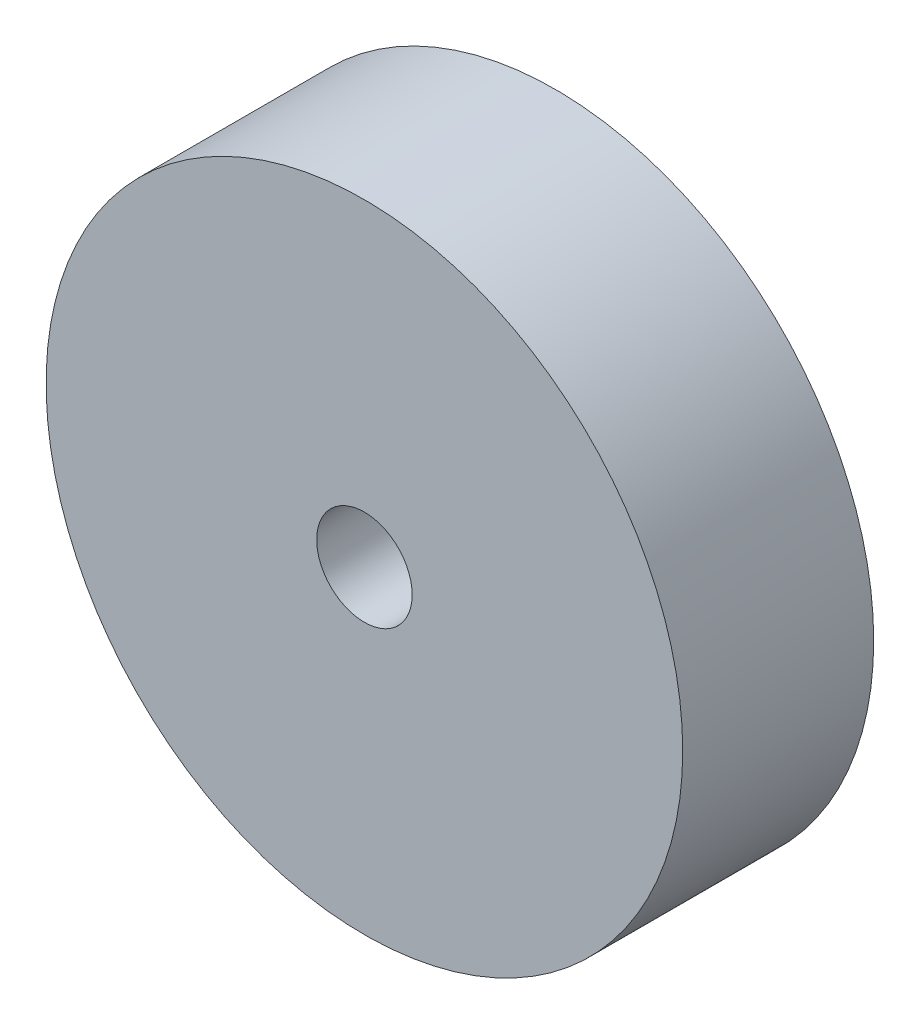
ISO-10303-21;
HEADER;
FILE_DESCRIPTION(('STEP AP214'),'2;1');
FILE_NAME('part.step','',(''),(''),'','','');
FILE_SCHEMA(('AUTOMOTIVE_DESIGN { 1 0 10303 214 1 1 1 1 }'));
ENDSEC;
DATA;
#1=APPLICATION_CONTEXT('core data for automotive mechanical design processes');
#2=APPLICATION_PROTOCOL_DEFINITION('international standard','automotive_design',2000,#1);
#3=PRODUCT_CONTEXT('',#1,'mechanical');
#4=PRODUCT('Part','Part','',(#3));
#5=PRODUCT_RELATED_PRODUCT_CATEGORY('part','',(#4));
#6=PRODUCT_DEFINITION_FORMATION('','',#4);
#7=PRODUCT_DEFINITION_CONTEXT('part definition',#1,'design');
#8=PRODUCT_DEFINITION('design','',#6,#7);
#9=PRODUCT_DEFINITION_SHAPE('','',#8);
#10=(LENGTH_UNIT() NAMED_UNIT(*) SI_UNIT(.MILLI.,.METRE.));
#11=(NAMED_UNIT(*) PLANE_ANGLE_UNIT() SI_UNIT($,.RADIAN.));
#12=(NAMED_UNIT(*) SI_UNIT($,.STERADIAN.) SOLID_ANGLE_UNIT());
#13=UNCERTAINTY_MEASURE_WITH_UNIT(LENGTH_MEASURE(1.E-05),#10,'distance_accuracy_value','');
#14=(GEOMETRIC_REPRESENTATION_CONTEXT(3) GLOBAL_UNCERTAINTY_ASSIGNED_CONTEXT((#13)) GLOBAL_UNIT_ASSIGNED_CONTEXT((#10,
#11,#12)) REPRESENTATION_CONTEXT('',''));
#15=CARTESIAN_POINT('',(0.,0.,0.));
#16=DIRECTION('',(0.,0.,1.));
#17=DIRECTION('',(1.,0.,0.));
#18=AXIS2_PLACEMENT_3D('',#15,#16,#17);
#19=CARTESIAN_POINT('',(0.,0.,3.));
#20=DIRECTION('',(0.,0.,1.));
#21=DIRECTION('',(1.,0.,0.));
#22=AXIS2_PLACEMENT_3D('',#19,#20,#21);
#23=PLANE('',#22);
#24=CARTESIAN_POINT('',(0.,0.,3.));
#25=DIRECTION('',(0.,0.,1.));
#26=DIRECTION('',(1.,0.,0.));
#27=AXIS2_PLACEMENT_3D('',#24,#25,#26);
#28=CIRCLE('',#27,5.);
#29=CARTESIAN_POINT('',(5.,0.,3.));
#30=VERTEX_POINT('',#29);
#31=EDGE_CURVE('E10',#30,#30,#28,.T.);
#32=ORIENTED_EDGE('',*,*,#31,.T.);
#33=EDGE_LOOP('',(#32));
#34=FACE_BOUND('',#33,.T.);
#35=CARTESIAN_POINT('',(0.,0.,3.));
#36=DIRECTION('',(0.,0.,1.));
#37=DIRECTION('',(1.,0.,0.));
#38=AXIS2_PLACEMENT_3D('',#35,#36,#37);
#39=CIRCLE('',#38,0.75);
#40=CARTESIAN_POINT('',(0.75,0.,3.));
#41=VERTEX_POINT('',#40);
#42=EDGE_CURVE('E50',#41,#41,#39,.T.);
#43=ORIENTED_EDGE('',*,*,#42,.F.);
#44=EDGE_LOOP('',(#43));
#45=FACE_BOUND('',#44,.T.);
#46=ADVANCED_FACE('F37',(#34,#45),#23,.T.);
#47=CARTESIAN_POINT('',(0.,0.,0.));
#48=DIRECTION('',(0.,0.,1.));
#49=DIRECTION('',(1.,0.,0.));
#50=AXIS2_PLACEMENT_3D('',#47,#48,#49);
#51=PLANE('',#50);
#52=CARTESIAN_POINT('',(0.,0.,0.));
#53=DIRECTION('',(0.,0.,1.));
#54=DIRECTION('',(1.,0.,0.));
#55=AXIS2_PLACEMENT_3D('',#52,#53,#54);
#56=CIRCLE('',#55,5.);
#57=CARTESIAN_POINT('',(5.,0.,0.));
#58=VERTEX_POINT('',#57);
#59=EDGE_CURVE('E41',#58,#58,#56,.T.);
#60=ORIENTED_EDGE('',*,*,#59,.F.);
#61=EDGE_LOOP('',(#60));
#62=FACE_BOUND('',#61,.T.);
#63=CARTESIAN_POINT('',(0.,0.,0.));
#64=DIRECTION('',(0.,0.,1.));
#65=DIRECTION('',(1.,0.,0.));
#66=AXIS2_PLACEMENT_3D('',#63,#64,#65);
#67=CIRCLE('',#66,0.75);
#68=CARTESIAN_POINT('',(0.75,0.,0.));
#69=VERTEX_POINT('',#68);
#70=EDGE_CURVE('E52',#69,#69,#67,.T.);
#71=ORIENTED_EDGE('',*,*,#70,.T.);
#72=EDGE_LOOP('',(#71));
#73=FACE_BOUND('',#72,.T.);
#74=ADVANCED_FACE('F64',(#62,#73),#51,.F.);
#75=CARTESIAN_POINT('',(0.,0.,3.));
#76=DIRECTION('',(0.,0.,-1.));
#77=DIRECTION('',(-1.,0.,0.));
#78=AXIS2_PLACEMENT_3D('',#75,#76,#77);
#79=CYLINDRICAL_SURFACE('',#78,5.);
#80=ORIENTED_EDGE('',*,*,#31,.F.);
#81=EDGE_LOOP('',(#80));
#82=FACE_BOUND('',#81,.T.);
#83=ORIENTED_EDGE('',*,*,#59,.T.);
#84=EDGE_LOOP('',(#83));
#85=FACE_BOUND('',#84,.T.);
#86=ADVANCED_FACE('F39',(#82,#85),#79,.T.);
#87=CARTESIAN_POINT('',(0.,0.,3.));
#88=DIRECTION('',(0.,0.,-1.));
#89=DIRECTION('',(-1.,0.,0.));
#90=AXIS2_PLACEMENT_3D('',#87,#88,#89);
#91=CYLINDRICAL_SURFACE('',#90,0.75);
#92=ORIENTED_EDGE('',*,*,#42,.T.);
#93=EDGE_LOOP('',(#92));
#94=FACE_BOUND('',#93,.T.);
#95=ORIENTED_EDGE('',*,*,#70,.F.);
#96=EDGE_LOOP('',(#95));
#97=FACE_BOUND('',#96,.T.);
#98=ADVANCED_FACE('F60',(#94,#97),#91,.F.);
#99=CLOSED_SHELL('',(#46,#74,#86,#98));
#100=MANIFOLD_SOLID_BREP('B2',#99);
#101=ADVANCED_BREP_SHAPE_REPRESENTATION('',(#18,#100),#14);
#102=SHAPE_DEFINITION_REPRESENTATION(#9,#101);
ENDSEC;
END-ISO-10303-21;
